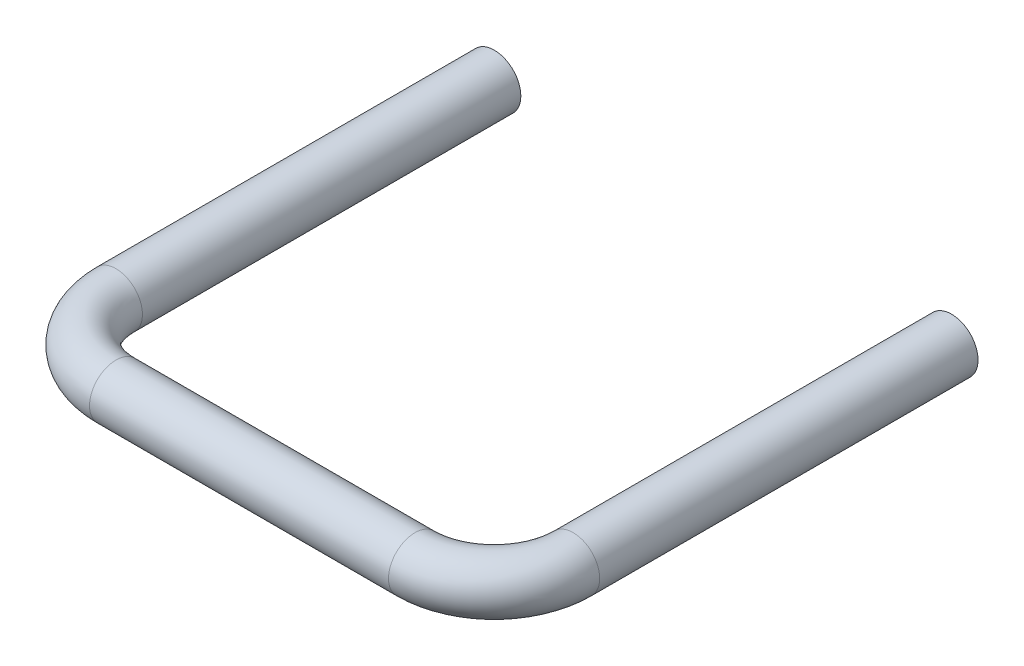
ISO-10303-21;
HEADER;
FILE_DESCRIPTION(('STEP AP214'),'2;1');
FILE_NAME('part.step','',(''),(''),'','','');
FILE_SCHEMA(('AUTOMOTIVE_DESIGN { 1 0 10303 214 1 1 1 1 }'));
ENDSEC;
DATA;
#1=APPLICATION_CONTEXT('core data for automotive mechanical design processes');
#2=APPLICATION_PROTOCOL_DEFINITION('international standard','automotive_design',2000,#1);
#3=PRODUCT_CONTEXT('',#1,'mechanical');
#4=PRODUCT('Part','Part','',(#3));
#5=PRODUCT_RELATED_PRODUCT_CATEGORY('part','',(#4));
#6=PRODUCT_DEFINITION_FORMATION('','',#4);
#7=PRODUCT_DEFINITION_CONTEXT('part definition',#1,'design');
#8=PRODUCT_DEFINITION('design','',#6,#7);
#9=PRODUCT_DEFINITION_SHAPE('','',#8);
#10=(LENGTH_UNIT() NAMED_UNIT(*) SI_UNIT(.MILLI.,.METRE.));
#11=(NAMED_UNIT(*) PLANE_ANGLE_UNIT() SI_UNIT($,.RADIAN.));
#12=(NAMED_UNIT(*) SI_UNIT($,.STERADIAN.) SOLID_ANGLE_UNIT());
#13=UNCERTAINTY_MEASURE_WITH_UNIT(LENGTH_MEASURE(1.E-05),#10,'distance_accuracy_value','');
#14=(GEOMETRIC_REPRESENTATION_CONTEXT(3) GLOBAL_UNCERTAINTY_ASSIGNED_CONTEXT((#13)) GLOBAL_UNIT_ASSIGNED_CONTEXT((#10,
#11,#12)) REPRESENTATION_CONTEXT('',''));
#15=CARTESIAN_POINT('',(0.,0.,0.));
#16=DIRECTION('',(0.,0.,1.));
#17=DIRECTION('',(1.,0.,0.));
#18=AXIS2_PLACEMENT_3D('',#15,#16,#17);
#19=CARTESIAN_POINT('',(-20.6248,171.45,20.9042));
#20=DIRECTION('',(0.,0.,-1.));
#21=DIRECTION('',(-1.,0.,0.));
#22=AXIS2_PLACEMENT_3D('',#19,#20,#21);
#23=CYLINDRICAL_SURFACE('',#22,2.38760000000001);
#24=CARTESIAN_POINT('',(-20.6248,171.45,20.9042));
#25=DIRECTION('',(0.,0.,1.));
#26=DIRECTION('',(1.,0.,0.));
#27=AXIS2_PLACEMENT_3D('',#24,#25,#26);
#28=CIRCLE('',#27,2.38760000000001);
#29=CARTESIAN_POINT('',(-23.0124,171.45,20.9042));
#30=VERTEX_POINT('',#29);
#31=EDGE_CURVE('E38',#30,#30,#28,.T.);
#32=ORIENTED_EDGE('',*,*,#31,.F.);
#33=EDGE_LOOP('',(#32));
#34=FACE_BOUND('',#33,.T.);
#35=CARTESIAN_POINT('',(-20.6248,171.45,-13.2334));
#36=DIRECTION('',(0.,0.,1.));
#37=DIRECTION('',(1.,0.,0.));
#38=AXIS2_PLACEMENT_3D('',#35,#36,#37);
#39=CIRCLE('',#38,2.38760000000001);
#40=CARTESIAN_POINT('',(-18.2372,171.45,-13.2334));
#41=VERTEX_POINT('',#40);
#42=EDGE_CURVE('E11',#41,#41,#39,.T.);
#43=ORIENTED_EDGE('',*,*,#42,.T.);
#44=EDGE_LOOP('',(#43));
#45=FACE_BOUND('',#44,.T.);
#46=ADVANCED_FACE('F32',(#34,#45),#23,.T.);
#47=CARTESIAN_POINT('',(-13.4874,171.45,20.9042));
#48=DIRECTION('',(0.,-1.,0.));
#49=DIRECTION('',(0.,0.,-1.));
#50=AXIS2_PLACEMENT_3D('',#47,#48,#49);
#51=TOROIDAL_SURFACE('',#50,7.13740000000001,2.38760000000001);
#52=CARTESIAN_POINT('',(-13.4874,171.45,28.0416));
#53=DIRECTION('',(1.,0.,0.));
#54=DIRECTION('',(0.,0.,-1.));
#55=AXIS2_PLACEMENT_3D('',#52,#53,#54);
#56=CIRCLE('',#55,2.38760000000001);
#57=CARTESIAN_POINT('',(-13.4874,171.45,30.4292));
#58=VERTEX_POINT('',#57);
#59=EDGE_CURVE('E42',#58,#58,#56,.T.);
#60=CARTESIAN_POINT('',(-13.4874,171.45,20.9042));
#61=DIRECTION('',(0.,-1.,0.));
#62=DIRECTION('',(0.,0.,-1.));
#63=AXIS2_PLACEMENT_3D('',#60,#61,#62);
#64=CIRCLE('',#63,9.52500000000002);
#65=EDGE_CURVE('',#58,#30,#64,.T.);
#66=ORIENTED_EDGE('',*,*,#59,.F.);
#67=ORIENTED_EDGE('',*,*,#31,.T.);
#68=ORIENTED_EDGE('',*,*,#65,.T.);
#69=ORIENTED_EDGE('',*,*,#65,.F.);
#70=EDGE_LOOP('',(#66,#68,#67,#69));
#71=FACE_BOUND('',#70,.T.);
#72=ADVANCED_FACE('F70',(#71),#51,.T.);
#73=CARTESIAN_POINT('',(13.4874,171.45,28.0416));
#74=DIRECTION('',(-1.,0.,0.));
#75=DIRECTION('',(0.,0.,1.));
#76=AXIS2_PLACEMENT_3D('',#73,#74,#75);
#77=CYLINDRICAL_SURFACE('',#76,2.38760000000001);
#78=CARTESIAN_POINT('',(13.4874,171.45,28.0416));
#79=DIRECTION('',(1.,0.,0.));
#80=DIRECTION('',(0.,0.,-1.));
#81=AXIS2_PLACEMENT_3D('',#78,#79,#80);
#82=CIRCLE('',#81,2.38760000000001);
#83=CARTESIAN_POINT('',(13.4874,171.45,30.4292));
#84=VERTEX_POINT('',#83);
#85=EDGE_CURVE('E46',#84,#84,#82,.T.);
#86=ORIENTED_EDGE('',*,*,#85,.F.);
#87=EDGE_LOOP('',(#86));
#88=FACE_BOUND('',#87,.T.);
#89=ORIENTED_EDGE('',*,*,#59,.T.);
#90=EDGE_LOOP('',(#89));
#91=FACE_BOUND('',#90,.T.);
#92=ADVANCED_FACE('F64',(#88,#91),#77,.T.);
#93=CARTESIAN_POINT('',(13.4874,171.45,20.9042));
#94=DIRECTION('',(0.,-1.,0.));
#95=DIRECTION('',(0.,0.,-1.));
#96=AXIS2_PLACEMENT_3D('',#93,#94,#95);
#97=TOROIDAL_SURFACE('',#96,7.13740000000001,2.38760000000001);
#98=CARTESIAN_POINT('',(20.6248,171.45,20.9042));
#99=DIRECTION('',(0.,0.,-1.));
#100=DIRECTION('',(-1.,0.,0.));
#101=AXIS2_PLACEMENT_3D('',#98,#99,#100);
#102=CIRCLE('',#101,2.38760000000001);
#103=CARTESIAN_POINT('',(23.0124,171.45,20.9042));
#104=VERTEX_POINT('',#103);
#105=EDGE_CURVE('E51',#104,#104,#102,.T.);
#106=CARTESIAN_POINT('',(13.4874,171.45,20.9042));
#107=DIRECTION('',(0.,-1.,0.));
#108=DIRECTION('',(0.,0.,-1.));
#109=AXIS2_PLACEMENT_3D('',#106,#107,#108);
#110=CIRCLE('',#109,9.52500000000002);
#111=EDGE_CURVE('',#104,#84,#110,.T.);
#112=ORIENTED_EDGE('',*,*,#105,.F.);
#113=ORIENTED_EDGE('',*,*,#85,.T.);
#114=ORIENTED_EDGE('',*,*,#111,.T.);
#115=ORIENTED_EDGE('',*,*,#111,.F.);
#116=EDGE_LOOP('',(#112,#114,#113,#115));
#117=FACE_BOUND('',#116,.T.);
#118=ADVANCED_FACE('F61',(#117),#97,.T.);
#119=CARTESIAN_POINT('',(20.6248,171.45,20.9042));
#120=DIRECTION('',(0.,0.,-1.));
#121=DIRECTION('',(-1.,0.,0.));
#122=AXIS2_PLACEMENT_3D('',#119,#120,#121);
#123=CYLINDRICAL_SURFACE('',#122,2.38760000000001);
#124=ORIENTED_EDGE('',*,*,#105,.T.);
#125=EDGE_LOOP('',(#124));
#126=FACE_BOUND('',#125,.T.);
#127=CARTESIAN_POINT('',(20.6248,171.45,-13.2334));
#128=DIRECTION('',(0.,0.,-1.));
#129=DIRECTION('',(-1.,0.,0.));
#130=AXIS2_PLACEMENT_3D('',#127,#128,#129);
#131=CIRCLE('',#130,2.38760000000001);
#132=CARTESIAN_POINT('',(18.2372,171.45,-13.2334));
#133=VERTEX_POINT('',#132);
#134=EDGE_CURVE('E52',#133,#133,#131,.T.);
#135=ORIENTED_EDGE('',*,*,#134,.F.);
#136=EDGE_LOOP('',(#135));
#137=FACE_BOUND('',#136,.T.);
#138=ADVANCED_FACE('F58',(#126,#137),#123,.T.);
#139=CARTESIAN_POINT('',(-20.6248,171.45,-13.2334));
#140=DIRECTION('',(0.,0.,1.));
#141=DIRECTION('',(1.,0.,0.));
#142=AXIS2_PLACEMENT_3D('',#139,#140,#141);
#143=PLANE('',#142);
#144=ORIENTED_EDGE('',*,*,#42,.F.);
#145=EDGE_LOOP('',(#144));
#146=FACE_BOUND('',#145,.T.);
#147=ADVANCED_FACE('F82',(#146),#143,.F.);
#148=CARTESIAN_POINT('',(20.6248,171.45,-13.2334));
#149=DIRECTION('',(0.,0.,-1.));
#150=DIRECTION('',(-1.,0.,0.));
#151=AXIS2_PLACEMENT_3D('',#148,#149,#150);
#152=PLANE('',#151);
#153=ORIENTED_EDGE('',*,*,#134,.T.);
#154=EDGE_LOOP('',(#153));
#155=FACE_BOUND('',#154,.T.);
#156=ADVANCED_FACE('F83',(#155),#152,.T.);
#157=CLOSED_SHELL('',(#46,#72,#92,#118,#138,#147,#156));
#158=MANIFOLD_SOLID_BREP('B2',#157);
#159=ADVANCED_BREP_SHAPE_REPRESENTATION('',(#18,#158),#14);
#160=SHAPE_DEFINITION_REPRESENTATION(#9,#159);
ENDSEC;
END-ISO-10303-21;
